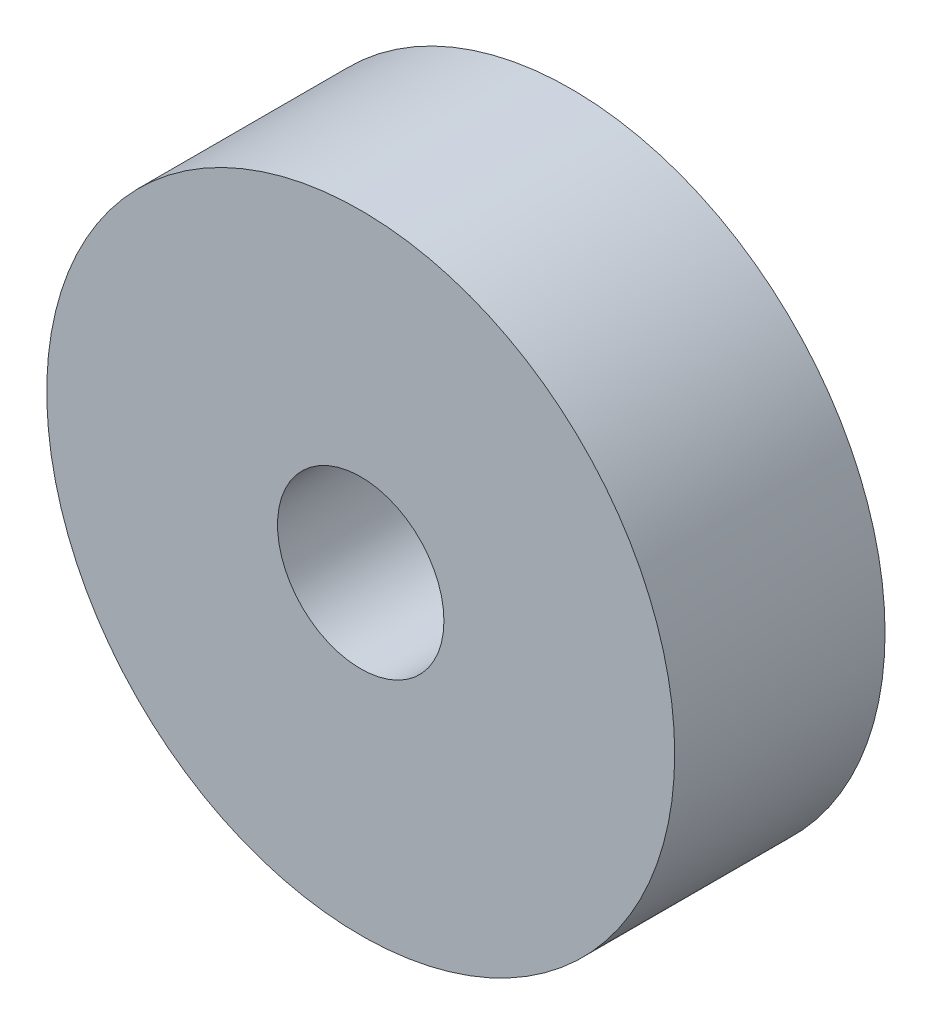
ISO-10303-21;
HEADER;
FILE_DESCRIPTION(('STEP AP214'),'2;1');
FILE_NAME('part.step','',(''),(''),'','','');
FILE_SCHEMA(('AUTOMOTIVE_DESIGN { 1 0 10303 214 1 1 1 1 }'));
ENDSEC;
DATA;
#1=APPLICATION_CONTEXT('core data for automotive mechanical design processes');
#2=APPLICATION_PROTOCOL_DEFINITION('international standard','automotive_design',2000,#1);
#3=PRODUCT_CONTEXT('',#1,'mechanical');
#4=PRODUCT('Part','Part','',(#3));
#5=PRODUCT_RELATED_PRODUCT_CATEGORY('part','',(#4));
#6=PRODUCT_DEFINITION_FORMATION('','',#4);
#7=PRODUCT_DEFINITION_CONTEXT('part definition',#1,'design');
#8=PRODUCT_DEFINITION('design','',#6,#7);
#9=PRODUCT_DEFINITION_SHAPE('','',#8);
#10=(LENGTH_UNIT() NAMED_UNIT(*) SI_UNIT(.MILLI.,.METRE.));
#11=(NAMED_UNIT(*) PLANE_ANGLE_UNIT() SI_UNIT($,.RADIAN.));
#12=(NAMED_UNIT(*) SI_UNIT($,.STERADIAN.) SOLID_ANGLE_UNIT());
#13=UNCERTAINTY_MEASURE_WITH_UNIT(LENGTH_MEASURE(1.E-05),#10,'distance_accuracy_value','');
#14=(GEOMETRIC_REPRESENTATION_CONTEXT(3) GLOBAL_UNCERTAINTY_ASSIGNED_CONTEXT((#13)) GLOBAL_UNIT_ASSIGNED_CONTEXT((#10,
#11,#12)) REPRESENTATION_CONTEXT('',''));
#15=CARTESIAN_POINT('',(0.,0.,0.));
#16=DIRECTION('',(0.,0.,1.));
#17=DIRECTION('',(1.,0.,0.));
#18=AXIS2_PLACEMENT_3D('',#15,#16,#17);
#19=CARTESIAN_POINT('',(0.,0.,67.));
#20=DIRECTION('',(0.,0.,1.));
#21=DIRECTION('',(1.,0.,0.));
#22=AXIS2_PLACEMENT_3D('',#19,#20,#21);
#23=PLANE('',#22);
#24=CARTESIAN_POINT('',(0.,0.,67.));
#25=DIRECTION('',(0.,0.,1.));
#26=DIRECTION('',(1.,0.,0.));
#27=AXIS2_PLACEMENT_3D('',#24,#25,#26);
#28=CIRCLE('',#27,100.);
#29=CARTESIAN_POINT('',(100.,0.,67.));
#30=VERTEX_POINT('',#29);
#31=EDGE_CURVE('E10',#30,#30,#28,.T.);
#32=ORIENTED_EDGE('',*,*,#31,.T.);
#33=EDGE_LOOP('',(#32));
#34=FACE_BOUND('',#33,.T.);
#35=CARTESIAN_POINT('',(0.,0.,67.));
#36=DIRECTION('',(0.,0.,1.));
#37=DIRECTION('',(1.,0.,0.));
#38=AXIS2_PLACEMENT_3D('',#35,#36,#37);
#39=CIRCLE('',#38,26.5);
#40=CARTESIAN_POINT('',(26.5,0.,67.));
#41=VERTEX_POINT('',#40);
#42=EDGE_CURVE('E50',#41,#41,#39,.T.);
#43=ORIENTED_EDGE('',*,*,#42,.F.);
#44=EDGE_LOOP('',(#43));
#45=FACE_BOUND('',#44,.T.);
#46=ADVANCED_FACE('F37',(#34,#45),#23,.T.);
#47=CARTESIAN_POINT('',(0.,0.,0.));
#48=DIRECTION('',(0.,0.,1.));
#49=DIRECTION('',(1.,0.,0.));
#50=AXIS2_PLACEMENT_3D('',#47,#48,#49);
#51=PLANE('',#50);
#52=CARTESIAN_POINT('',(0.,0.,0.));
#53=DIRECTION('',(0.,0.,1.));
#54=DIRECTION('',(1.,0.,0.));
#55=AXIS2_PLACEMENT_3D('',#52,#53,#54);
#56=CIRCLE('',#55,100.);
#57=CARTESIAN_POINT('',(100.,0.,0.));
#58=VERTEX_POINT('',#57);
#59=EDGE_CURVE('E41',#58,#58,#56,.T.);
#60=ORIENTED_EDGE('',*,*,#59,.F.);
#61=EDGE_LOOP('',(#60));
#62=FACE_BOUND('',#61,.T.);
#63=CARTESIAN_POINT('',(0.,0.,0.));
#64=DIRECTION('',(0.,0.,1.));
#65=DIRECTION('',(1.,0.,0.));
#66=AXIS2_PLACEMENT_3D('',#63,#64,#65);
#67=CIRCLE('',#66,26.5);
#68=CARTESIAN_POINT('',(26.5,0.,0.));
#69=VERTEX_POINT('',#68);
#70=EDGE_CURVE('E52',#69,#69,#67,.T.);
#71=ORIENTED_EDGE('',*,*,#70,.T.);
#72=EDGE_LOOP('',(#71));
#73=FACE_BOUND('',#72,.T.);
#74=ADVANCED_FACE('F64',(#62,#73),#51,.F.);
#75=CARTESIAN_POINT('',(0.,0.,67.));
#76=DIRECTION('',(0.,0.,-1.));
#77=DIRECTION('',(-1.,0.,0.));
#78=AXIS2_PLACEMENT_3D('',#75,#76,#77);
#79=CYLINDRICAL_SURFACE('',#78,100.);
#80=ORIENTED_EDGE('',*,*,#31,.F.);
#81=EDGE_LOOP('',(#80));
#82=FACE_BOUND('',#81,.T.);
#83=ORIENTED_EDGE('',*,*,#59,.T.);
#84=EDGE_LOOP('',(#83));
#85=FACE_BOUND('',#84,.T.);
#86=ADVANCED_FACE('F39',(#82,#85),#79,.T.);
#87=CARTESIAN_POINT('',(0.,0.,67.));
#88=DIRECTION('',(0.,0.,-1.));
#89=DIRECTION('',(-1.,0.,0.));
#90=AXIS2_PLACEMENT_3D('',#87,#88,#89);
#91=CYLINDRICAL_SURFACE('',#90,26.5);
#92=ORIENTED_EDGE('',*,*,#42,.T.);
#93=EDGE_LOOP('',(#92));
#94=FACE_BOUND('',#93,.T.);
#95=ORIENTED_EDGE('',*,*,#70,.F.);
#96=EDGE_LOOP('',(#95));
#97=FACE_BOUND('',#96,.T.);
#98=ADVANCED_FACE('F60',(#94,#97),#91,.F.);
#99=CLOSED_SHELL('',(#46,#74,#86,#98));
#100=MANIFOLD_SOLID_BREP('B2',#99);
#101=ADVANCED_BREP_SHAPE_REPRESENTATION('',(#18,#100),#14);
#102=SHAPE_DEFINITION_REPRESENTATION(#9,#101);
ENDSEC;
END-ISO-10303-21;
